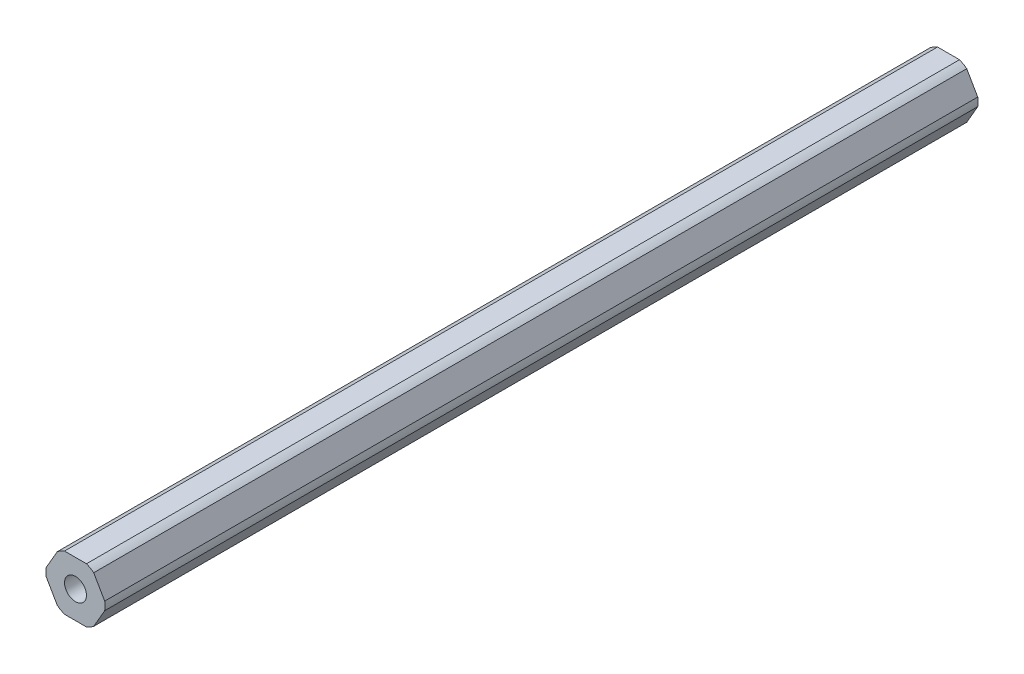
ISO-10303-21;
HEADER;
FILE_DESCRIPTION(('STEP AP214'),'2;1');
FILE_NAME('part.step','',(''),(''),'','','');
FILE_SCHEMA(('AUTOMOTIVE_DESIGN { 1 0 10303 214 1 1 1 1 }'));
ENDSEC;
DATA;
#1=APPLICATION_CONTEXT('core data for automotive mechanical design processes');
#2=APPLICATION_PROTOCOL_DEFINITION('international standard','automotive_design',2000,#1);
#3=PRODUCT_CONTEXT('',#1,'mechanical');
#4=PRODUCT('Part','Part','',(#3));
#5=PRODUCT_RELATED_PRODUCT_CATEGORY('part','',(#4));
#6=PRODUCT_DEFINITION_FORMATION('','',#4);
#7=PRODUCT_DEFINITION_CONTEXT('part definition',#1,'design');
#8=PRODUCT_DEFINITION('design','',#6,#7);
#9=PRODUCT_DEFINITION_SHAPE('','',#8);
#10=(LENGTH_UNIT() NAMED_UNIT(*) SI_UNIT(.MILLI.,.METRE.));
#11=(NAMED_UNIT(*) PLANE_ANGLE_UNIT() SI_UNIT($,.RADIAN.));
#12=(NAMED_UNIT(*) SI_UNIT($,.STERADIAN.) SOLID_ANGLE_UNIT());
#13=UNCERTAINTY_MEASURE_WITH_UNIT(LENGTH_MEASURE(1.E-05),#10,'distance_accuracy_value','');
#14=(GEOMETRIC_REPRESENTATION_CONTEXT(3) GLOBAL_UNCERTAINTY_ASSIGNED_CONTEXT((#13)) GLOBAL_UNIT_ASSIGNED_CONTEXT((#10,
#11,#12)) REPRESENTATION_CONTEXT('',''));
#15=CARTESIAN_POINT('',(0.,0.,0.));
#16=DIRECTION('',(0.,0.,1.));
#17=DIRECTION('',(1.,0.,0.));
#18=AXIS2_PLACEMENT_3D('',#15,#16,#17);
#19=CARTESIAN_POINT('',(0.,0.,-228.6));
#20=DIRECTION('',(0.,0.,1.));
#21=DIRECTION('',(1.,0.,0.));
#22=AXIS2_PLACEMENT_3D('',#19,#20,#21);
#23=CYLINDRICAL_SURFACE('',#22,6.87);
#24=CARTESIAN_POINT('',(0.,0.,25.4));
#25=DIRECTION('',(0.,0.,1.));
#26=DIRECTION('',(1.,0.,0.));
#27=AXIS2_PLACEMENT_3D('',#24,#25,#26);
#28=CIRCLE('',#27,6.87);
#29=CARTESIAN_POINT('',(6.80102150534208,0.97108520937895,25.4));
#30=VERTEX_POINT('',#29);
#31=CARTESIAN_POINT('',(6.80102150534208,-0.971085209378955,25.4));
#32=VERTEX_POINT('',#31);
#33=EDGE_CURVE('E190',#30,#32,#28,.F.);
#34=ORIENTED_EDGE('',*,*,#33,.F.);
#35=DIRECTION('',(0.,0.,1.));
#36=VECTOR('',#35,1.);
#37=CARTESIAN_POINT('',(6.80102150534208,0.97108520937895,228.6));
#38=LINE('',#37,#36);
#39=CARTESIAN_POINT('',(6.80102150534208,0.971085209378948,228.6));
#40=VERTEX_POINT('',#39);
#41=EDGE_CURVE('E170',#30,#40,#38,.T.);
#42=ORIENTED_EDGE('',*,*,#41,.T.);
#43=CARTESIAN_POINT('',(0.,0.,228.6));
#44=DIRECTION('',(0.,0.,1.));
#45=DIRECTION('',(1.,0.,0.));
#46=AXIS2_PLACEMENT_3D('',#43,#44,#45);
#47=CIRCLE('',#46,6.87);
#48=CARTESIAN_POINT('',(6.80102150534208,-0.971085209378954,228.6));
#49=VERTEX_POINT('',#48);
#50=EDGE_CURVE('E219',#40,#49,#47,.F.);
#51=ORIENTED_EDGE('',*,*,#50,.T.);
#52=DIRECTION('',(0.,0.,1.));
#53=VECTOR('',#52,1.);
#54=CARTESIAN_POINT('',(6.80102150534208,-0.971085209378955,228.6));
#55=LINE('',#54,#53);
#56=EDGE_CURVE('E249',#49,#32,#55,.F.);
#57=ORIENTED_EDGE('',*,*,#56,.T.);
#58=EDGE_LOOP('',(#34,#42,#51,#57));
#59=FACE_BOUND('',#58,.T.);
#60=ADVANCED_FACE('F45',(#59),#23,.T.);
#61=CARTESIAN_POINT('',(3.68083890619154,6.3754,228.6));
#62=DIRECTION('',(0.,-1.,0.));
#63=DIRECTION('',(1.,0.,0.));
#64=AXIS2_PLACEMENT_3D('',#61,#62,#63);
#65=PLANE('',#64);
#66=DIRECTION('',(0.,0.,1.));
#67=VECTOR('',#66,1.);
#68=CARTESIAN_POINT('',(2.55952629210953,6.37540000000001,-228.6));
#69=LINE('',#68,#67);
#70=CARTESIAN_POINT('',(2.55952629210953,6.37540000000001,25.4));
#71=VERTEX_POINT('',#70);
#72=CARTESIAN_POINT('',(2.55952629210953,6.37540000000001,228.6));
#73=VERTEX_POINT('',#72);
#74=EDGE_CURVE('E169',#71,#73,#69,.T.);
#75=ORIENTED_EDGE('',*,*,#74,.F.);
#76=DIRECTION('',(-1.,0.,0.));
#77=VECTOR('',#76,1.);
#78=CARTESIAN_POINT('',(3.68083890619154,6.3754,25.4));
#79=LINE('',#78,#77);
#80=CARTESIAN_POINT('',(-2.55952629210953,6.37540000000001,25.4));
#81=VERTEX_POINT('',#80);
#82=EDGE_CURVE('E65',#71,#81,#79,.T.);
#83=ORIENTED_EDGE('',*,*,#82,.T.);
#84=DIRECTION('',(0.,0.,1.));
#85=VECTOR('',#84,1.);
#86=CARTESIAN_POINT('',(-2.55952629210953,6.37540000000001,-228.6));
#87=LINE('',#86,#85);
#88=CARTESIAN_POINT('',(-2.55952629210953,6.37540000000001,228.6));
#89=VERTEX_POINT('',#88);
#90=EDGE_CURVE('E274',#89,#81,#87,.F.);
#91=ORIENTED_EDGE('',*,*,#90,.F.);
#92=DIRECTION('',(1.,0.,0.));
#93=VECTOR('',#92,1.);
#94=CARTESIAN_POINT('',(0.,6.3754,228.6));
#95=LINE('',#94,#93);
#96=EDGE_CURVE('E236',#73,#89,#95,.F.);
#97=ORIENTED_EDGE('',*,*,#96,.F.);
#98=EDGE_LOOP('',(#75,#83,#91,#97));
#99=FACE_BOUND('',#98,.T.);
#100=ADVANCED_FACE('F330',(#99),#65,.F.);
#101=CARTESIAN_POINT('',(0.,0.,-228.6));
#102=DIRECTION('',(0.,0.,1.));
#103=DIRECTION('',(1.,0.,0.));
#104=AXIS2_PLACEMENT_3D('',#101,#102,#103);
#105=CYLINDRICAL_SURFACE('',#104,6.87);
#106=CARTESIAN_POINT('',(0.,0.,25.4));
#107=DIRECTION('',(0.,0.,1.));
#108=DIRECTION('',(1.,0.,0.));
#109=AXIS2_PLACEMENT_3D('',#106,#107,#108);
#110=CIRCLE('',#109,6.87);
#111=CARTESIAN_POINT('',(-4.24149521323255,5.40431479062104,25.4));
#112=VERTEX_POINT('',#111);
#113=EDGE_CURVE('E73',#112,#81,#110,.F.);
#114=ORIENTED_EDGE('',*,*,#113,.F.);
#115=DIRECTION('',(0.,0.,1.));
#116=VECTOR('',#115,1.);
#117=CARTESIAN_POINT('',(-4.24149521323255,5.40431479062104,228.6));
#118=LINE('',#117,#116);
#119=CARTESIAN_POINT('',(-4.24149521323255,5.40431479062105,228.6));
#120=VERTEX_POINT('',#119);
#121=EDGE_CURVE('E271',#112,#120,#118,.T.);
#122=ORIENTED_EDGE('',*,*,#121,.T.);
#123=CARTESIAN_POINT('',(0.,0.,228.6));
#124=DIRECTION('',(0.,0.,1.));
#125=DIRECTION('',(1.,0.,0.));
#126=AXIS2_PLACEMENT_3D('',#123,#124,#125);
#127=CIRCLE('',#126,6.87);
#128=EDGE_CURVE('E235',#89,#120,#127,.T.);
#129=ORIENTED_EDGE('',*,*,#128,.F.);
#130=ORIENTED_EDGE('',*,*,#90,.T.);
#131=EDGE_LOOP('',(#114,#122,#129,#130));
#132=FACE_BOUND('',#131,.T.);
#133=ADVANCED_FACE('F328',(#132),#105,.T.);
#134=CARTESIAN_POINT('',(-3.68083890619154,6.3754,228.6));
#135=DIRECTION('',(0.866025403784439,-0.5,0.));
#136=DIRECTION('',(0.5,0.866025403784439,0.));
#137=AXIS2_PLACEMENT_3D('',#134,#135,#136);
#138=PLANE('',#137);
#139=ORIENTED_EDGE('',*,*,#121,.F.);
#140=DIRECTION('',(-0.5,-0.866025403784439,0.));
#141=VECTOR('',#140,1.);
#142=CARTESIAN_POINT('',(-3.68083890619154,6.3754,25.4));
#143=LINE('',#142,#141);
#144=CARTESIAN_POINT('',(-6.80102150534208,0.971085209378959,25.4));
#145=VERTEX_POINT('',#144);
#146=EDGE_CURVE('E214',#112,#145,#143,.T.);
#147=ORIENTED_EDGE('',*,*,#146,.T.);
#148=DIRECTION('',(0.,0.,1.));
#149=VECTOR('',#148,1.);
#150=CARTESIAN_POINT('',(-6.80102150534208,0.971085209378959,-228.6));
#151=LINE('',#150,#149);
#152=CARTESIAN_POINT('',(-6.80102150534208,0.971085209378961,228.6));
#153=VERTEX_POINT('',#152);
#154=EDGE_CURVE('E267',#153,#145,#151,.F.);
#155=ORIENTED_EDGE('',*,*,#154,.F.);
#156=DIRECTION('',(-0.5,-0.866025403784439,0.));
#157=VECTOR('',#156,1.);
#158=CARTESIAN_POINT('',(-4.24149521323255,5.40431479062104,228.6));
#159=LINE('',#158,#157);
#160=EDGE_CURVE('E232',#120,#153,#159,.T.);
#161=ORIENTED_EDGE('',*,*,#160,.F.);
#162=EDGE_LOOP('',(#139,#147,#155,#161));
#163=FACE_BOUND('',#162,.T.);
#164=ADVANCED_FACE('F326',(#163),#138,.F.);
#165=CARTESIAN_POINT('',(0.,0.,-228.6));
#166=DIRECTION('',(0.,0.,1.));
#167=DIRECTION('',(1.,0.,0.));
#168=AXIS2_PLACEMENT_3D('',#165,#166,#167);
#169=CYLINDRICAL_SURFACE('',#168,6.87);
#170=CARTESIAN_POINT('',(0.,0.,25.4));
#171=DIRECTION('',(0.,0.,1.));
#172=DIRECTION('',(1.,0.,0.));
#173=AXIS2_PLACEMENT_3D('',#170,#171,#172);
#174=CIRCLE('',#173,6.87);
#175=CARTESIAN_POINT('',(-6.80102150534208,-0.971085209378956,25.4));
#176=VERTEX_POINT('',#175);
#177=EDGE_CURVE('E210',#176,#145,#174,.F.);
#178=ORIENTED_EDGE('',*,*,#177,.F.);
#179=DIRECTION('',(0.,0.,1.));
#180=VECTOR('',#179,1.);
#181=CARTESIAN_POINT('',(-6.80102150534208,-0.971085209378956,228.6));
#182=LINE('',#181,#180);
#183=CARTESIAN_POINT('',(-6.80102150534208,-0.971085209378955,228.6));
#184=VERTEX_POINT('',#183);
#185=EDGE_CURVE('E264',#176,#184,#182,.T.);
#186=ORIENTED_EDGE('',*,*,#185,.T.);
#187=CARTESIAN_POINT('',(0.,0.,228.6));
#188=DIRECTION('',(0.,0.,1.));
#189=DIRECTION('',(1.,0.,0.));
#190=AXIS2_PLACEMENT_3D('',#187,#188,#189);
#191=CIRCLE('',#190,6.87);
#192=EDGE_CURVE('E231',#153,#184,#191,.T.);
#193=ORIENTED_EDGE('',*,*,#192,.F.);
#194=ORIENTED_EDGE('',*,*,#154,.T.);
#195=EDGE_LOOP('',(#178,#186,#193,#194));
#196=FACE_BOUND('',#195,.T.);
#197=ADVANCED_FACE('F322',(#196),#169,.T.);
#198=CARTESIAN_POINT('',(-7.36167781238308,0.,228.6));
#199=DIRECTION('',(0.866025403784439,0.5,0.));
#200=DIRECTION('',(-0.5,0.866025403784439,0.));
#201=AXIS2_PLACEMENT_3D('',#198,#199,#200);
#202=PLANE('',#201);
#203=ORIENTED_EDGE('',*,*,#185,.F.);
#204=DIRECTION('',(0.5,-0.866025403784439,0.));
#205=VECTOR('',#204,1.);
#206=CARTESIAN_POINT('',(-7.36167781238308,0.,25.4));
#207=LINE('',#206,#205);
#208=CARTESIAN_POINT('',(-4.24149521323255,-5.40431479062105,25.4));
#209=VERTEX_POINT('',#208);
#210=EDGE_CURVE('E207',#176,#209,#207,.T.);
#211=ORIENTED_EDGE('',*,*,#210,.T.);
#212=DIRECTION('',(0.,0.,1.));
#213=VECTOR('',#212,1.);
#214=CARTESIAN_POINT('',(-4.24149521323255,-5.40431479062105,-228.6));
#215=LINE('',#214,#213);
#216=CARTESIAN_POINT('',(-4.24149521323255,-5.40431479062105,228.6));
#217=VERTEX_POINT('',#216);
#218=EDGE_CURVE('E260',#217,#209,#215,.F.);
#219=ORIENTED_EDGE('',*,*,#218,.F.);
#220=DIRECTION('',(0.5,-0.866025403784439,0.));
#221=VECTOR('',#220,1.);
#222=CARTESIAN_POINT('',(-6.80102150534208,-0.971085209378956,228.6));
#223=LINE('',#222,#221);
#224=EDGE_CURVE('E228',#184,#217,#223,.T.);
#225=ORIENTED_EDGE('',*,*,#224,.F.);
#226=EDGE_LOOP('',(#203,#211,#219,#225));
#227=FACE_BOUND('',#226,.T.);
#228=ADVANCED_FACE('F320',(#227),#202,.F.);
#229=CARTESIAN_POINT('',(0.,0.,-228.6));
#230=DIRECTION('',(0.,0.,1.));
#231=DIRECTION('',(1.,0.,0.));
#232=AXIS2_PLACEMENT_3D('',#229,#230,#231);
#233=CYLINDRICAL_SURFACE('',#232,6.87);
#234=CARTESIAN_POINT('',(0.,0.,25.4));
#235=DIRECTION('',(0.,0.,1.));
#236=DIRECTION('',(1.,0.,0.));
#237=AXIS2_PLACEMENT_3D('',#234,#235,#236);
#238=CIRCLE('',#237,6.87);
#239=CARTESIAN_POINT('',(-2.55952629210953,-6.3754,25.4));
#240=VERTEX_POINT('',#239);
#241=EDGE_CURVE('E203',#240,#209,#238,.F.);
#242=ORIENTED_EDGE('',*,*,#241,.F.);
#243=DIRECTION('',(0.,0.,1.));
#244=VECTOR('',#243,1.);
#245=CARTESIAN_POINT('',(-2.55952629210953,-6.3754,228.6));
#246=LINE('',#245,#244);
#247=CARTESIAN_POINT('',(-2.55952629210953,-6.3754,228.6));
#248=VERTEX_POINT('',#247);
#249=EDGE_CURVE('E257',#240,#248,#246,.T.);
#250=ORIENTED_EDGE('',*,*,#249,.T.);
#251=CARTESIAN_POINT('',(0.,0.,228.6));
#252=DIRECTION('',(0.,0.,1.));
#253=DIRECTION('',(1.,0.,0.));
#254=AXIS2_PLACEMENT_3D('',#251,#252,#253);
#255=CIRCLE('',#254,6.87);
#256=EDGE_CURVE('E227',#217,#248,#255,.T.);
#257=ORIENTED_EDGE('',*,*,#256,.F.);
#258=ORIENTED_EDGE('',*,*,#218,.T.);
#259=EDGE_LOOP('',(#242,#250,#257,#258));
#260=FACE_BOUND('',#259,.T.);
#261=ADVANCED_FACE('F314',(#260),#233,.T.);
#262=CARTESIAN_POINT('',(-3.68083890619154,-6.3754,228.6));
#263=DIRECTION('',(0.,1.,0.));
#264=DIRECTION('',(0.,0.,1.));
#265=AXIS2_PLACEMENT_3D('',#262,#263,#264);
#266=PLANE('',#265);
#267=ORIENTED_EDGE('',*,*,#249,.F.);
#268=DIRECTION('',(1.,0.,0.));
#269=VECTOR('',#268,1.);
#270=CARTESIAN_POINT('',(-3.68083890619154,-6.3754,25.4));
#271=LINE('',#270,#269);
#272=CARTESIAN_POINT('',(2.55952629210953,-6.3754,25.4));
#273=VERTEX_POINT('',#272);
#274=EDGE_CURVE('E200',#240,#273,#271,.T.);
#275=ORIENTED_EDGE('',*,*,#274,.T.);
#276=DIRECTION('',(0.,0.,1.));
#277=VECTOR('',#276,1.);
#278=CARTESIAN_POINT('',(2.55952629210953,-6.3754,-228.6));
#279=LINE('',#278,#277);
#280=CARTESIAN_POINT('',(2.55952629210953,-6.3754,228.6));
#281=VERTEX_POINT('',#280);
#282=EDGE_CURVE('E253',#281,#273,#279,.F.);
#283=ORIENTED_EDGE('',*,*,#282,.F.);
#284=DIRECTION('',(1.,0.,0.));
#285=VECTOR('',#284,1.);
#286=CARTESIAN_POINT('',(0.,-6.3754,228.6));
#287=LINE('',#286,#285);
#288=EDGE_CURVE('E224',#248,#281,#287,.T.);
#289=ORIENTED_EDGE('',*,*,#288,.F.);
#290=EDGE_LOOP('',(#267,#275,#283,#289));
#291=FACE_BOUND('',#290,.T.);
#292=ADVANCED_FACE('F311',(#291),#266,.F.);
#293=CARTESIAN_POINT('',(0.,0.,-228.6));
#294=DIRECTION('',(0.,0.,1.));
#295=DIRECTION('',(1.,0.,0.));
#296=AXIS2_PLACEMENT_3D('',#293,#294,#295);
#297=CYLINDRICAL_SURFACE('',#296,6.87);
#298=CARTESIAN_POINT('',(0.,0.,25.4));
#299=DIRECTION('',(0.,0.,1.));
#300=DIRECTION('',(1.,0.,0.));
#301=AXIS2_PLACEMENT_3D('',#298,#299,#300);
#302=CIRCLE('',#301,6.87);
#303=CARTESIAN_POINT('',(4.24149521323254,-5.40431479062105,25.4));
#304=VERTEX_POINT('',#303);
#305=EDGE_CURVE('E196',#304,#273,#302,.F.);
#306=ORIENTED_EDGE('',*,*,#305,.F.);
#307=DIRECTION('',(0.,0.,1.));
#308=VECTOR('',#307,1.);
#309=CARTESIAN_POINT('',(4.24149521323254,-5.40431479062105,228.6));
#310=LINE('',#309,#308);
#311=CARTESIAN_POINT('',(4.24149521323254,-5.40431479062105,228.6));
#312=VERTEX_POINT('',#311);
#313=EDGE_CURVE('E246',#304,#312,#310,.T.);
#314=ORIENTED_EDGE('',*,*,#313,.T.);
#315=CARTESIAN_POINT('',(0.,0.,228.6));
#316=DIRECTION('',(0.,0.,1.));
#317=DIRECTION('',(1.,0.,0.));
#318=AXIS2_PLACEMENT_3D('',#315,#316,#317);
#319=CIRCLE('',#318,6.87);
#320=EDGE_CURVE('E223',#281,#312,#319,.T.);
#321=ORIENTED_EDGE('',*,*,#320,.F.);
#322=ORIENTED_EDGE('',*,*,#282,.T.);
#323=EDGE_LOOP('',(#306,#314,#321,#322));
#324=FACE_BOUND('',#323,.T.);
#325=ADVANCED_FACE('F306',(#324),#297,.T.);
#326=CARTESIAN_POINT('',(3.68083890619154,-6.3754,228.6));
#327=DIRECTION('',(-0.866025403784439,0.5,0.));
#328=DIRECTION('',(-0.5,-0.866025403784439,0.));
#329=AXIS2_PLACEMENT_3D('',#326,#327,#328);
#330=PLANE('',#329);
#331=ORIENTED_EDGE('',*,*,#313,.F.);
#332=DIRECTION('',(0.5,0.866025403784439,0.));
#333=VECTOR('',#332,1.);
#334=CARTESIAN_POINT('',(3.68083890619154,-6.3754,25.4));
#335=LINE('',#334,#333);
#336=EDGE_CURVE('E193',#304,#32,#335,.T.);
#337=ORIENTED_EDGE('',*,*,#336,.T.);
#338=ORIENTED_EDGE('',*,*,#56,.F.);
#339=DIRECTION('',(0.5,0.866025403784439,0.));
#340=VECTOR('',#339,1.);
#341=CARTESIAN_POINT('',(4.24149521323254,-5.40431479062105,228.6));
#342=LINE('',#341,#340);
#343=EDGE_CURVE('E54',#312,#49,#342,.T.);
#344=ORIENTED_EDGE('',*,*,#343,.F.);
#345=EDGE_LOOP('',(#331,#337,#338,#344));
#346=FACE_BOUND('',#345,.T.);
#347=ADVANCED_FACE('F298',(#346),#330,.F.);
#348=CARTESIAN_POINT('',(7.36167781238308,0.,228.6));
#349=DIRECTION('',(-0.866025403784439,-0.5,0.));
#350=DIRECTION('',(0.5,-0.866025403784439,0.));
#351=AXIS2_PLACEMENT_3D('',#348,#349,#350);
#352=PLANE('',#351);
#353=ORIENTED_EDGE('',*,*,#41,.F.);
#354=DIRECTION('',(-0.5,0.866025403784439,0.));
#355=VECTOR('',#354,1.);
#356=CARTESIAN_POINT('',(7.36167781238308,0.,25.4));
#357=LINE('',#356,#355);
#358=CARTESIAN_POINT('',(4.24149521323254,5.40431479062105,25.4));
#359=VERTEX_POINT('',#358);
#360=EDGE_CURVE('E174',#30,#359,#357,.T.);
#361=ORIENTED_EDGE('',*,*,#360,.T.);
#362=DIRECTION('',(0.,0.,1.));
#363=VECTOR('',#362,1.);
#364=CARTESIAN_POINT('',(4.24149521323254,5.40431479062105,-228.6));
#365=LINE('',#364,#363);
#366=CARTESIAN_POINT('',(4.24149521323254,5.40431479062105,228.6));
#367=VERTEX_POINT('',#366);
#368=EDGE_CURVE('E159',#367,#359,#365,.F.);
#369=ORIENTED_EDGE('',*,*,#368,.F.);
#370=DIRECTION('',(-0.5,0.866025403784438,0.));
#371=VECTOR('',#370,1.);
#372=CARTESIAN_POINT('',(6.80102150534208,0.97108520937895,228.6));
#373=LINE('',#372,#371);
#374=EDGE_CURVE('E239',#40,#367,#373,.T.);
#375=ORIENTED_EDGE('',*,*,#374,.F.);
#376=EDGE_LOOP('',(#353,#361,#369,#375));
#377=FACE_BOUND('',#376,.T.);
#378=ADVANCED_FACE('F175',(#377),#352,.F.);
#379=CARTESIAN_POINT('',(0.,0.,-228.6));
#380=DIRECTION('',(0.,0.,1.));
#381=DIRECTION('',(1.,0.,0.));
#382=AXIS2_PLACEMENT_3D('',#379,#380,#381);
#383=CYLINDRICAL_SURFACE('',#382,6.87);
#384=CARTESIAN_POINT('',(0.,0.,25.4));
#385=DIRECTION('',(0.,0.,1.));
#386=DIRECTION('',(1.,0.,0.));
#387=AXIS2_PLACEMENT_3D('',#384,#385,#386);
#388=CIRCLE('',#387,6.87);
#389=EDGE_CURVE('E163',#71,#359,#388,.F.);
#390=ORIENTED_EDGE('',*,*,#389,.F.);
#391=ORIENTED_EDGE('',*,*,#74,.T.);
#392=CARTESIAN_POINT('',(0.,0.,228.6));
#393=DIRECTION('',(0.,0.,1.));
#394=DIRECTION('',(1.,0.,0.));
#395=AXIS2_PLACEMENT_3D('',#392,#393,#394);
#396=CIRCLE('',#395,6.87);
#397=EDGE_CURVE('E165',#367,#73,#396,.T.);
#398=ORIENTED_EDGE('',*,*,#397,.F.);
#399=ORIENTED_EDGE('',*,*,#368,.T.);
#400=EDGE_LOOP('',(#390,#391,#398,#399));
#401=FACE_BOUND('',#400,.T.);
#402=ADVANCED_FACE('F161',(#401),#383,.T.);
#403=CARTESIAN_POINT('',(0.,0.,228.6));
#404=DIRECTION('',(0.,0.,1.));
#405=DIRECTION('',(1.,0.,0.));
#406=AXIS2_PLACEMENT_3D('',#403,#404,#405);
#407=PLANE('',#406);
#408=ORIENTED_EDGE('',*,*,#343,.T.);
#409=ORIENTED_EDGE('',*,*,#50,.F.);
#410=ORIENTED_EDGE('',*,*,#374,.T.);
#411=ORIENTED_EDGE('',*,*,#397,.T.);
#412=ORIENTED_EDGE('',*,*,#96,.T.);
#413=ORIENTED_EDGE('',*,*,#128,.T.);
#414=ORIENTED_EDGE('',*,*,#160,.T.);
#415=ORIENTED_EDGE('',*,*,#192,.T.);
#416=ORIENTED_EDGE('',*,*,#224,.T.);
#417=ORIENTED_EDGE('',*,*,#256,.T.);
#418=ORIENTED_EDGE('',*,*,#288,.T.);
#419=ORIENTED_EDGE('',*,*,#320,.T.);
#420=EDGE_LOOP('',(#408,#409,#410,#411,#412,#413,#414,#415,#416,#417,#418,#419));
#421=FACE_BOUND('',#420,.T.);
#422=CARTESIAN_POINT('',(0.,0.,228.6));
#423=DIRECTION('',(0.,0.,1.));
#424=DIRECTION('',(1.,0.,0.));
#425=AXIS2_PLACEMENT_3D('',#422,#423,#424);
#426=CIRCLE('',#425,2.55);
#427=CARTESIAN_POINT('',(2.55,0.,228.6));
#428=VERTEX_POINT('',#427);
#429=EDGE_CURVE('E12',#428,#428,#426,.F.);
#430=ORIENTED_EDGE('',*,*,#429,.T.);
#431=EDGE_LOOP('',(#430));
#432=FACE_BOUND('',#431,.T.);
#433=ADVANCED_FACE('F300',(#421,#432),#407,.T.);
#434=CARTESIAN_POINT('',(0.,0.,-228.6));
#435=DIRECTION('',(0.,0.,1.));
#436=DIRECTION('',(1.,0.,0.));
#437=AXIS2_PLACEMENT_3D('',#434,#435,#436);
#438=CYLINDRICAL_SURFACE('',#437,2.55);
#439=CARTESIAN_POINT('',(0.,0.,25.4));
#440=DIRECTION('',(0.,0.,1.));
#441=DIRECTION('',(1.,0.,0.));
#442=AXIS2_PLACEMENT_3D('',#439,#440,#441);
#443=CIRCLE('',#442,2.55);
#444=CARTESIAN_POINT('',(2.55,0.,25.4));
#445=VERTEX_POINT('',#444);
#446=EDGE_CURVE('E48',#445,#445,#443,.F.);
#447=ORIENTED_EDGE('',*,*,#446,.T.);
#448=EDGE_LOOP('',(#447));
#449=FACE_BOUND('',#448,.T.);
#450=ORIENTED_EDGE('',*,*,#429,.F.);
#451=EDGE_LOOP('',(#450));
#452=FACE_BOUND('',#451,.T.);
#453=ADVANCED_FACE('F337',(#449,#452),#438,.F.);
#454=CARTESIAN_POINT('',(0.,0.,25.4));
#455=DIRECTION('',(0.,0.,1.));
#456=DIRECTION('',(1.,0.,0.));
#457=AXIS2_PLACEMENT_3D('',#454,#455,#456);
#458=PLANE('',#457);
#459=ORIENTED_EDGE('',*,*,#146,.F.);
#460=ORIENTED_EDGE('',*,*,#113,.T.);
#461=ORIENTED_EDGE('',*,*,#82,.F.);
#462=ORIENTED_EDGE('',*,*,#389,.T.);
#463=ORIENTED_EDGE('',*,*,#360,.F.);
#464=ORIENTED_EDGE('',*,*,#33,.T.);
#465=ORIENTED_EDGE('',*,*,#336,.F.);
#466=ORIENTED_EDGE('',*,*,#305,.T.);
#467=ORIENTED_EDGE('',*,*,#274,.F.);
#468=ORIENTED_EDGE('',*,*,#241,.T.);
#469=ORIENTED_EDGE('',*,*,#210,.F.);
#470=ORIENTED_EDGE('',*,*,#177,.T.);
#471=EDGE_LOOP('',(#459,#460,#461,#462,#463,#464,#465,#466,#467,#468,#469,#470));
#472=FACE_BOUND('',#471,.T.);
#473=ORIENTED_EDGE('',*,*,#446,.F.);
#474=EDGE_LOOP('',(#473));
#475=FACE_BOUND('',#474,.T.);
#476=ADVANCED_FACE('F181',(#472,#475),#458,.F.);
#477=CLOSED_SHELL('',(#60,#100,#133,#164,#197,#228,#261,#292,#325,#347,#378,#402,#433,#453,#476));
#478=MANIFOLD_SOLID_BREP('B2',#477);
#479=ADVANCED_BREP_SHAPE_REPRESENTATION('',(#18,#478),#14);
#480=SHAPE_DEFINITION_REPRESENTATION(#9,#479);
ENDSEC;
END-ISO-10303-21;
